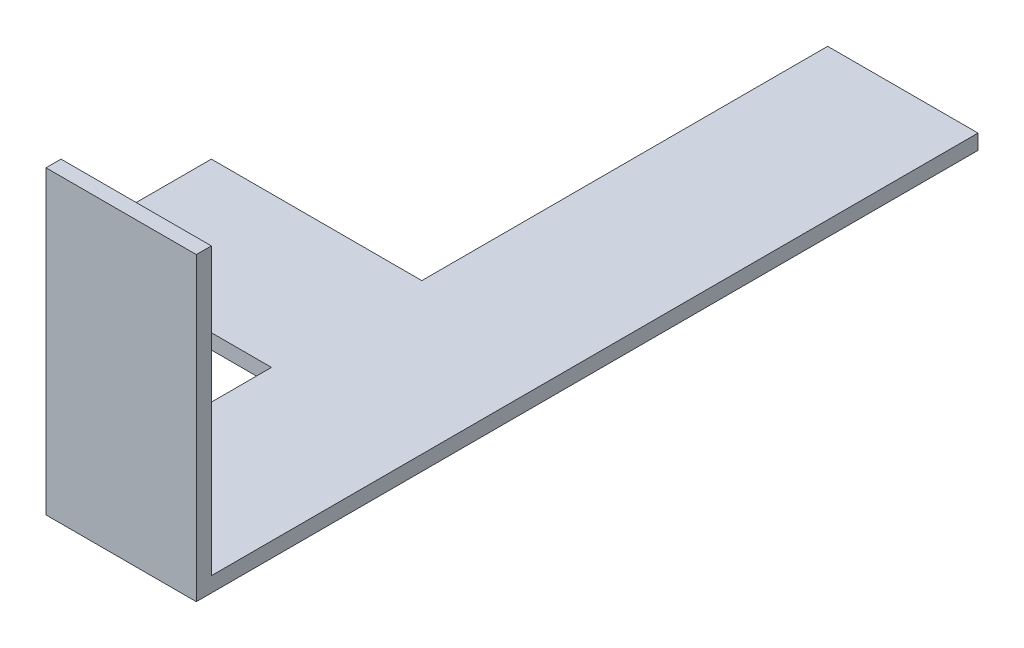
ISO-10303-21;
HEADER;
FILE_DESCRIPTION(('STEP AP214'),'2;1');
FILE_NAME('part.step','',(''),(''),'','','');
FILE_SCHEMA(('AUTOMOTIVE_DESIGN { 1 0 10303 214 1 1 1 1 }'));
ENDSEC;
DATA;
#1=APPLICATION_CONTEXT('core data for automotive mechanical design processes');
#2=APPLICATION_PROTOCOL_DEFINITION('international standard','automotive_design',2000,#1);
#3=PRODUCT_CONTEXT('',#1,'mechanical');
#4=PRODUCT('Part','Part','',(#3));
#5=PRODUCT_RELATED_PRODUCT_CATEGORY('part','',(#4));
#6=PRODUCT_DEFINITION_FORMATION('','',#4);
#7=PRODUCT_DEFINITION_CONTEXT('part definition',#1,'design');
#8=PRODUCT_DEFINITION('design','',#6,#7);
#9=PRODUCT_DEFINITION_SHAPE('','',#8);
#10=(LENGTH_UNIT() NAMED_UNIT(*) SI_UNIT(.MILLI.,.METRE.));
#11=(NAMED_UNIT(*) PLANE_ANGLE_UNIT() SI_UNIT($,.RADIAN.));
#12=(NAMED_UNIT(*) SI_UNIT($,.STERADIAN.) SOLID_ANGLE_UNIT());
#13=UNCERTAINTY_MEASURE_WITH_UNIT(LENGTH_MEASURE(1.E-05),#10,'distance_accuracy_value','');
#14=(GEOMETRIC_REPRESENTATION_CONTEXT(3) GLOBAL_UNCERTAINTY_ASSIGNED_CONTEXT((#13)) GLOBAL_UNIT_ASSIGNED_CONTEXT((#10,
#11,#12)) REPRESENTATION_CONTEXT('',''));
#15=CARTESIAN_POINT('',(0.,0.,0.));
#16=DIRECTION('',(0.,0.,1.));
#17=DIRECTION('',(1.,0.,0.));
#18=AXIS2_PLACEMENT_3D('',#15,#16,#17);
#19=CARTESIAN_POINT('',(10.,1.,0.));
#20=DIRECTION('',(1.,0.,0.));
#21=DIRECTION('',(0.,0.,-1.));
#22=AXIS2_PLACEMENT_3D('',#19,#20,#21);
#23=PLANE('',#22);
#24=DIRECTION('',(0.,0.,1.));
#25=VECTOR('',#24,1.);
#26=CARTESIAN_POINT('',(10.,1.,0.));
#27=LINE('',#26,#25);
#28=CARTESIAN_POINT('',(10.,1.,0.));
#29=VERTEX_POINT('',#28);
#30=CARTESIAN_POINT('',(10.,1.,51.));
#31=VERTEX_POINT('',#30);
#32=EDGE_CURVE('E155',#29,#31,#27,.T.);
#33=ORIENTED_EDGE('',*,*,#32,.T.);
#34=DIRECTION('',(0.,-1.,0.));
#35=VECTOR('',#34,1.);
#36=CARTESIAN_POINT('',(10.,20.,51.));
#37=LINE('',#36,#35);
#38=CARTESIAN_POINT('',(10.,20.,51.));
#39=VERTEX_POINT('',#38);
#40=EDGE_CURVE('E350',#39,#31,#37,.T.);
#41=ORIENTED_EDGE('',*,*,#40,.F.);
#42=DIRECTION('',(0.,0.,1.));
#43=VECTOR('',#42,1.);
#44=CARTESIAN_POINT('',(10.,20.,52.));
#45=LINE('',#44,#43);
#46=CARTESIAN_POINT('',(10.,20.,52.));
#47=VERTEX_POINT('',#46);
#48=EDGE_CURVE('E178',#39,#47,#45,.T.);
#49=ORIENTED_EDGE('',*,*,#48,.T.);
#50=DIRECTION('',(0.,-1.,0.));
#51=VECTOR('',#50,1.);
#52=CARTESIAN_POINT('',(10.,1.,52.));
#53=LINE('',#52,#51);
#54=CARTESIAN_POINT('',(10.,0.,52.));
#55=VERTEX_POINT('',#54);
#56=EDGE_CURVE('E139',#47,#55,#53,.T.);
#57=ORIENTED_EDGE('',*,*,#56,.T.);
#58=DIRECTION('',(0.,0.,1.));
#59=VECTOR('',#58,1.);
#60=CARTESIAN_POINT('',(10.,0.,0.));
#61=LINE('',#60,#59);
#62=CARTESIAN_POINT('',(10.,0.,0.));
#63=VERTEX_POINT('',#62);
#64=EDGE_CURVE('E93',#63,#55,#61,.T.);
#65=ORIENTED_EDGE('',*,*,#64,.F.);
#66=DIRECTION('',(0.,-1.,0.));
#67=VECTOR('',#66,1.);
#68=CARTESIAN_POINT('',(10.,1.,0.));
#69=LINE('',#68,#67);
#70=EDGE_CURVE('E11',#29,#63,#69,.T.);
#71=ORIENTED_EDGE('',*,*,#70,.F.);
#72=EDGE_LOOP('',(#33,#41,#49,#57,#65,#71));
#73=FACE_BOUND('',#72,.T.);
#74=ADVANCED_FACE('F39',(#73),#23,.T.);
#75=CARTESIAN_POINT('',(0.,1.,0.));
#76=DIRECTION('',(0.,0.,-1.));
#77=DIRECTION('',(-1.,0.,0.));
#78=AXIS2_PLACEMENT_3D('',#75,#76,#77);
#79=PLANE('',#78);
#80=DIRECTION('',(1.,0.,0.));
#81=VECTOR('',#80,1.);
#82=CARTESIAN_POINT('',(0.,0.,0.));
#83=LINE('',#82,#81);
#84=CARTESIAN_POINT('',(0.,0.,0.));
#85=VERTEX_POINT('',#84);
#86=EDGE_CURVE('E141',#85,#63,#83,.T.);
#87=ORIENTED_EDGE('',*,*,#86,.F.);
#88=DIRECTION('',(0.,-1.,0.));
#89=VECTOR('',#88,1.);
#90=CARTESIAN_POINT('',(0.,1.,0.));
#91=LINE('',#90,#89);
#92=CARTESIAN_POINT('',(0.,1.,0.));
#93=VERTEX_POINT('',#92);
#94=EDGE_CURVE('E46',#93,#85,#91,.T.);
#95=ORIENTED_EDGE('',*,*,#94,.F.);
#96=DIRECTION('',(1.,0.,0.));
#97=VECTOR('',#96,1.);
#98=CARTESIAN_POINT('',(0.,1.,0.));
#99=LINE('',#98,#97);
#100=EDGE_CURVE('E172',#93,#29,#99,.T.);
#101=ORIENTED_EDGE('',*,*,#100,.T.);
#102=ORIENTED_EDGE('',*,*,#70,.T.);
#103=EDGE_LOOP('',(#87,#95,#101,#102));
#104=FACE_BOUND('',#103,.T.);
#105=ADVANCED_FACE('F171',(#104),#79,.T.);
#106=CARTESIAN_POINT('',(0.,1.,0.));
#107=DIRECTION('',(1.,0.,0.));
#108=DIRECTION('',(0.,0.,-1.));
#109=AXIS2_PLACEMENT_3D('',#106,#107,#108);
#110=PLANE('',#109);
#111=DIRECTION('',(0.,0.,1.));
#112=VECTOR('',#111,1.);
#113=CARTESIAN_POINT('',(0.,0.,0.));
#114=LINE('',#113,#112);
#115=CARTESIAN_POINT('',(0.,0.,27.));
#116=VERTEX_POINT('',#115);
#117=EDGE_CURVE('E143',#85,#116,#114,.T.);
#118=ORIENTED_EDGE('',*,*,#117,.T.);
#119=DIRECTION('',(0.,-1.,0.));
#120=VECTOR('',#119,1.);
#121=CARTESIAN_POINT('',(0.,1.,27.));
#122=LINE('',#121,#120);
#123=CARTESIAN_POINT('',(0.,1.,27.));
#124=VERTEX_POINT('',#123);
#125=EDGE_CURVE('E128',#124,#116,#122,.T.);
#126=ORIENTED_EDGE('',*,*,#125,.F.);
#127=DIRECTION('',(0.,0.,1.));
#128=VECTOR('',#127,1.);
#129=CARTESIAN_POINT('',(0.,1.,0.));
#130=LINE('',#129,#128);
#131=EDGE_CURVE('E116',#93,#124,#130,.T.);
#132=ORIENTED_EDGE('',*,*,#131,.F.);
#133=ORIENTED_EDGE('',*,*,#94,.T.);
#134=EDGE_LOOP('',(#118,#126,#132,#133));
#135=FACE_BOUND('',#134,.T.);
#136=ADVANCED_FACE('F166',(#135),#110,.F.);
#137=CARTESIAN_POINT('',(0.,1.,27.));
#138=DIRECTION('',(0.,0.,1.));
#139=DIRECTION('',(1.,0.,0.));
#140=AXIS2_PLACEMENT_3D('',#137,#138,#139);
#141=PLANE('',#140);
#142=DIRECTION('',(-1.,0.,0.));
#143=VECTOR('',#142,1.);
#144=CARTESIAN_POINT('',(0.,0.,27.));
#145=LINE('',#144,#143);
#146=CARTESIAN_POINT('',(-14.,0.,27.));
#147=VERTEX_POINT('',#146);
#148=EDGE_CURVE('E125',#116,#147,#145,.T.);
#149=ORIENTED_EDGE('',*,*,#148,.T.);
#150=DIRECTION('',(0.,-1.,0.));
#151=VECTOR('',#150,1.);
#152=CARTESIAN_POINT('',(-14.,1.,27.));
#153=LINE('',#152,#151);
#154=CARTESIAN_POINT('',(-14.,1.,27.));
#155=VERTEX_POINT('',#154);
#156=EDGE_CURVE('E122',#155,#147,#153,.T.);
#157=ORIENTED_EDGE('',*,*,#156,.F.);
#158=DIRECTION('',(-1.,0.,0.));
#159=VECTOR('',#158,1.);
#160=CARTESIAN_POINT('',(0.,1.,27.));
#161=LINE('',#160,#159);
#162=EDGE_CURVE('E108',#124,#155,#161,.T.);
#163=ORIENTED_EDGE('',*,*,#162,.F.);
#164=ORIENTED_EDGE('',*,*,#125,.T.);
#165=EDGE_LOOP('',(#149,#157,#163,#164));
#166=FACE_BOUND('',#165,.T.);
#167=ADVANCED_FACE('F123',(#166),#141,.F.);
#168=CARTESIAN_POINT('',(-14.,1.,0.));
#169=DIRECTION('',(1.,0.,0.));
#170=DIRECTION('',(0.,0.,-1.));
#171=AXIS2_PLACEMENT_3D('',#168,#169,#170);
#172=PLANE('',#171);
#173=DIRECTION('',(0.,0.,1.));
#174=VECTOR('',#173,1.);
#175=CARTESIAN_POINT('',(-14.,0.,0.));
#176=LINE('',#175,#174);
#177=CARTESIAN_POINT('',(-14.,0.,37.));
#178=VERTEX_POINT('',#177);
#179=EDGE_CURVE('E146',#147,#178,#176,.T.);
#180=ORIENTED_EDGE('',*,*,#179,.T.);
#181=DIRECTION('',(0.,-1.,0.));
#182=VECTOR('',#181,1.);
#183=CARTESIAN_POINT('',(-14.,1.,37.));
#184=LINE('',#183,#182);
#185=CARTESIAN_POINT('',(-14.,1.,37.));
#186=VERTEX_POINT('',#185);
#187=EDGE_CURVE('E129',#186,#178,#184,.T.);
#188=ORIENTED_EDGE('',*,*,#187,.F.);
#189=DIRECTION('',(0.,0.,1.));
#190=VECTOR('',#189,1.);
#191=CARTESIAN_POINT('',(-14.,1.,0.));
#192=LINE('',#191,#190);
#193=EDGE_CURVE('E112',#155,#186,#192,.T.);
#194=ORIENTED_EDGE('',*,*,#193,.F.);
#195=ORIENTED_EDGE('',*,*,#156,.T.);
#196=EDGE_LOOP('',(#180,#188,#194,#195));
#197=FACE_BOUND('',#196,.T.);
#198=ADVANCED_FACE('F131',(#197),#172,.F.);
#199=CARTESIAN_POINT('',(0.,1.,37.));
#200=DIRECTION('',(0.,0.,-1.));
#201=DIRECTION('',(-1.,0.,0.));
#202=AXIS2_PLACEMENT_3D('',#199,#200,#201);
#203=PLANE('',#202);
#204=DIRECTION('',(1.,0.,0.));
#205=VECTOR('',#204,1.);
#206=CARTESIAN_POINT('',(0.,0.,37.));
#207=LINE('',#206,#205);
#208=CARTESIAN_POINT('',(0.,0.,37.));
#209=VERTEX_POINT('',#208);
#210=EDGE_CURVE('E148',#178,#209,#207,.T.);
#211=ORIENTED_EDGE('',*,*,#210,.T.);
#212=DIRECTION('',(0.,-1.,0.));
#213=VECTOR('',#212,1.);
#214=CARTESIAN_POINT('',(0.,1.,37.));
#215=LINE('',#214,#213);
#216=CARTESIAN_POINT('',(0.,1.,37.));
#217=VERTEX_POINT('',#216);
#218=EDGE_CURVE('E160',#217,#209,#215,.T.);
#219=ORIENTED_EDGE('',*,*,#218,.F.);
#220=DIRECTION('',(1.,0.,0.));
#221=VECTOR('',#220,1.);
#222=CARTESIAN_POINT('',(0.,1.,37.));
#223=LINE('',#222,#221);
#224=EDGE_CURVE('E60',#186,#217,#223,.T.);
#225=ORIENTED_EDGE('',*,*,#224,.F.);
#226=ORIENTED_EDGE('',*,*,#187,.T.);
#227=EDGE_LOOP('',(#211,#219,#225,#226));
#228=FACE_BOUND('',#227,.T.);
#229=ADVANCED_FACE('F194',(#228),#203,.F.);
#230=CARTESIAN_POINT('',(0.,1.,0.));
#231=DIRECTION('',(1.,0.,0.));
#232=DIRECTION('',(0.,0.,-1.));
#233=AXIS2_PLACEMENT_3D('',#230,#231,#232);
#234=PLANE('',#233);
#235=DIRECTION('',(0.,0.,1.));
#236=VECTOR('',#235,1.);
#237=CARTESIAN_POINT('',(0.,0.,0.));
#238=LINE('',#237,#236);
#239=CARTESIAN_POINT('',(0.,0.,52.));
#240=VERTEX_POINT('',#239);
#241=EDGE_CURVE('E150',#209,#240,#238,.T.);
#242=ORIENTED_EDGE('',*,*,#241,.T.);
#243=DIRECTION('',(0.,-1.,0.));
#244=VECTOR('',#243,1.);
#245=CARTESIAN_POINT('',(0.,1.,52.));
#246=LINE('',#245,#244);
#247=CARTESIAN_POINT('',(0.,20.,52.));
#248=VERTEX_POINT('',#247);
#249=EDGE_CURVE('E157',#248,#240,#246,.T.);
#250=ORIENTED_EDGE('',*,*,#249,.F.);
#251=DIRECTION('',(0.,0.,-1.));
#252=VECTOR('',#251,1.);
#253=CARTESIAN_POINT('',(0.,20.,52.));
#254=LINE('',#253,#252);
#255=CARTESIAN_POINT('',(0.,20.,51.));
#256=VERTEX_POINT('',#255);
#257=EDGE_CURVE('E342',#248,#256,#254,.T.);
#258=ORIENTED_EDGE('',*,*,#257,.T.);
#259=DIRECTION('',(0.,-1.,0.));
#260=VECTOR('',#259,1.);
#261=CARTESIAN_POINT('',(0.,20.,51.));
#262=LINE('',#261,#260);
#263=CARTESIAN_POINT('',(0.,1.,51.));
#264=VERTEX_POINT('',#263);
#265=EDGE_CURVE('E348',#256,#264,#262,.T.);
#266=ORIENTED_EDGE('',*,*,#265,.T.);
#267=DIRECTION('',(0.,0.,1.));
#268=VECTOR('',#267,1.);
#269=CARTESIAN_POINT('',(0.,1.,0.));
#270=LINE('',#269,#268);
#271=EDGE_CURVE('E134',#217,#264,#270,.T.);
#272=ORIENTED_EDGE('',*,*,#271,.F.);
#273=ORIENTED_EDGE('',*,*,#218,.T.);
#274=EDGE_LOOP('',(#242,#250,#258,#266,#272,#273));
#275=FACE_BOUND('',#274,.T.);
#276=ADVANCED_FACE('F187',(#275),#234,.F.);
#277=CARTESIAN_POINT('',(0.,1.,52.));
#278=DIRECTION('',(0.,0.,-1.));
#279=DIRECTION('',(-1.,0.,0.));
#280=AXIS2_PLACEMENT_3D('',#277,#278,#279);
#281=PLANE('',#280);
#282=DIRECTION('',(1.,0.,0.));
#283=VECTOR('',#282,1.);
#284=CARTESIAN_POINT('',(0.,0.,52.));
#285=LINE('',#284,#283);
#286=EDGE_CURVE('E152',#240,#55,#285,.T.);
#287=ORIENTED_EDGE('',*,*,#286,.T.);
#288=ORIENTED_EDGE('',*,*,#56,.F.);
#289=DIRECTION('',(-1.,0.,0.));
#290=VECTOR('',#289,1.);
#291=CARTESIAN_POINT('',(0.,20.,52.));
#292=LINE('',#291,#290);
#293=EDGE_CURVE('E343',#47,#248,#292,.T.);
#294=ORIENTED_EDGE('',*,*,#293,.T.);
#295=ORIENTED_EDGE('',*,*,#249,.T.);
#296=EDGE_LOOP('',(#287,#288,#294,#295));
#297=FACE_BOUND('',#296,.T.);
#298=ADVANCED_FACE('F182',(#297),#281,.F.);
#299=CARTESIAN_POINT('',(0.,1.,0.));
#300=DIRECTION('',(0.,1.,0.));
#301=DIRECTION('',(0.,0.,1.));
#302=AXIS2_PLACEMENT_3D('',#299,#300,#301);
#303=PLANE('',#302);
#304=DIRECTION('',(-1.,0.,0.));
#305=VECTOR('',#304,1.);
#306=CARTESIAN_POINT('',(0.,1.,51.));
#307=LINE('',#306,#305);
#308=EDGE_CURVE('E53',#31,#264,#307,.T.);
#309=ORIENTED_EDGE('',*,*,#308,.F.);
#310=ORIENTED_EDGE('',*,*,#32,.F.);
#311=ORIENTED_EDGE('',*,*,#100,.F.);
#312=ORIENTED_EDGE('',*,*,#131,.T.);
#313=ORIENTED_EDGE('',*,*,#162,.T.);
#314=ORIENTED_EDGE('',*,*,#193,.T.);
#315=ORIENTED_EDGE('',*,*,#224,.T.);
#316=ORIENTED_EDGE('',*,*,#271,.T.);
#317=EDGE_LOOP('',(#309,#310,#311,#312,#313,#314,#315,#316));
#318=FACE_BOUND('',#317,.T.);
#319=ADVANCED_FACE('F110',(#318),#303,.T.);
#320=CARTESIAN_POINT('',(0.,0.,0.));
#321=DIRECTION('',(0.,1.,0.));
#322=DIRECTION('',(0.,0.,1.));
#323=AXIS2_PLACEMENT_3D('',#320,#321,#322);
#324=PLANE('',#323);
#325=ORIENTED_EDGE('',*,*,#64,.T.);
#326=ORIENTED_EDGE('',*,*,#286,.F.);
#327=ORIENTED_EDGE('',*,*,#241,.F.);
#328=ORIENTED_EDGE('',*,*,#210,.F.);
#329=ORIENTED_EDGE('',*,*,#179,.F.);
#330=ORIENTED_EDGE('',*,*,#148,.F.);
#331=ORIENTED_EDGE('',*,*,#117,.F.);
#332=ORIENTED_EDGE('',*,*,#86,.T.);
#333=EDGE_LOOP('',(#325,#326,#327,#328,#329,#330,#331,#332));
#334=FACE_BOUND('',#333,.T.);
#335=ADVANCED_FACE('F170',(#334),#324,.F.);
#336=CARTESIAN_POINT('',(0.,20.,51.));
#337=DIRECTION('',(0.,0.,-1.));
#338=DIRECTION('',(-1.,0.,0.));
#339=AXIS2_PLACEMENT_3D('',#336,#337,#338);
#340=PLANE('',#339);
#341=ORIENTED_EDGE('',*,*,#40,.T.);
#342=ORIENTED_EDGE('',*,*,#308,.T.);
#343=ORIENTED_EDGE('',*,*,#265,.F.);
#344=DIRECTION('',(1.,0.,0.));
#345=VECTOR('',#344,1.);
#346=CARTESIAN_POINT('',(0.,20.,51.));
#347=LINE('',#346,#345);
#348=EDGE_CURVE('E346',#256,#39,#347,.T.);
#349=ORIENTED_EDGE('',*,*,#348,.T.);
#350=EDGE_LOOP('',(#341,#342,#343,#349));
#351=FACE_BOUND('',#350,.T.);
#352=ADVANCED_FACE('F268',(#351),#340,.T.);
#353=CARTESIAN_POINT('',(0.,20.,0.));
#354=DIRECTION('',(0.,-1.,0.));
#355=DIRECTION('',(0.,0.,-1.));
#356=AXIS2_PLACEMENT_3D('',#353,#354,#355);
#357=PLANE('',#356);
#358=ORIENTED_EDGE('',*,*,#257,.F.);
#359=ORIENTED_EDGE('',*,*,#293,.F.);
#360=ORIENTED_EDGE('',*,*,#48,.F.);
#361=ORIENTED_EDGE('',*,*,#348,.F.);
#362=EDGE_LOOP('',(#358,#359,#360,#361));
#363=FACE_BOUND('',#362,.T.);
#364=ADVANCED_FACE('F277',(#363),#357,.F.);
#365=CLOSED_SHELL('',(#74,#105,#136,#167,#198,#229,#276,#298,#319,#335,#352,#364));
#366=MANIFOLD_SOLID_BREP('B2',#365);
#367=ADVANCED_BREP_SHAPE_REPRESENTATION('',(#18,#366),#14);
#368=SHAPE_DEFINITION_REPRESENTATION(#9,#367);
ENDSEC;
END-ISO-10303-21;
